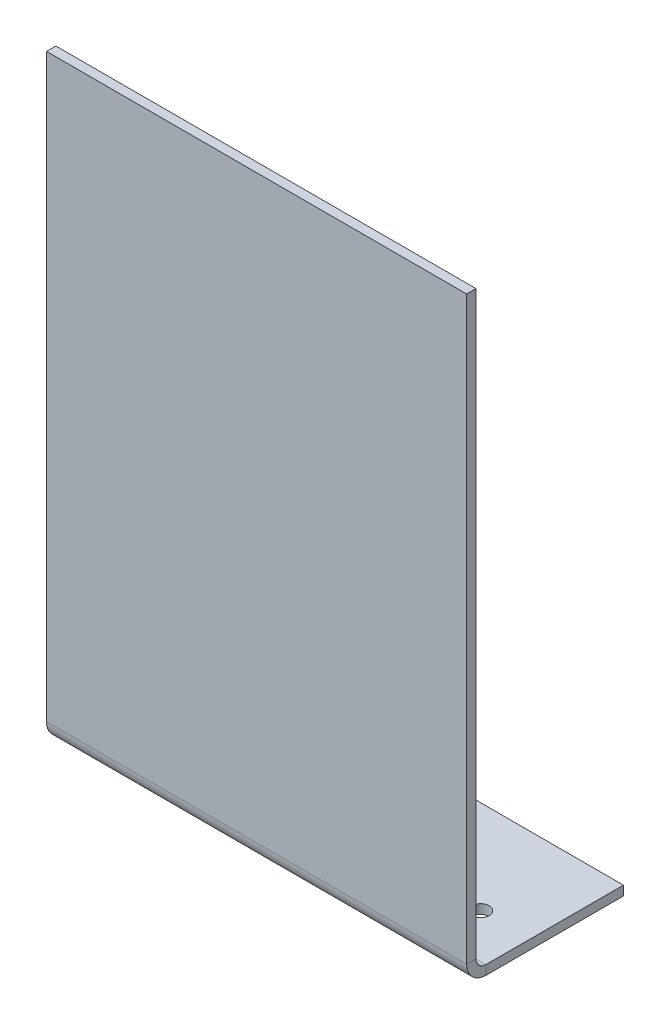
ISO-10303-21;
HEADER;
FILE_DESCRIPTION(('STEP AP214'),'2;1');
FILE_NAME('part.step','',(''),(''),'','','');
FILE_SCHEMA(('AUTOMOTIVE_DESIGN { 1 0 10303 214 1 1 1 1 }'));
ENDSEC;
DATA;
#1=APPLICATION_CONTEXT('core data for automotive mechanical design processes');
#2=APPLICATION_PROTOCOL_DEFINITION('international standard','automotive_design',2000,#1);
#3=PRODUCT_CONTEXT('',#1,'mechanical');
#4=PRODUCT('Part','Part','',(#3));
#5=PRODUCT_RELATED_PRODUCT_CATEGORY('part','',(#4));
#6=PRODUCT_DEFINITION_FORMATION('','',#4);
#7=PRODUCT_DEFINITION_CONTEXT('part definition',#1,'design');
#8=PRODUCT_DEFINITION('design','',#6,#7);
#9=PRODUCT_DEFINITION_SHAPE('','',#8);
#10=(LENGTH_UNIT() NAMED_UNIT(*) SI_UNIT(.MILLI.,.METRE.));
#11=(NAMED_UNIT(*) PLANE_ANGLE_UNIT() SI_UNIT($,.RADIAN.));
#12=(NAMED_UNIT(*) SI_UNIT($,.STERADIAN.) SOLID_ANGLE_UNIT());
#13=UNCERTAINTY_MEASURE_WITH_UNIT(LENGTH_MEASURE(1.E-05),#10,'distance_accuracy_value','');
#14=(GEOMETRIC_REPRESENTATION_CONTEXT(3) GLOBAL_UNCERTAINTY_ASSIGNED_CONTEXT((#13)) GLOBAL_UNIT_ASSIGNED_CONTEXT((#10,
#11,#12)) REPRESENTATION_CONTEXT('',''));
#15=CARTESIAN_POINT('',(0.,0.,0.));
#16=DIRECTION('',(0.,0.,1.));
#17=DIRECTION('',(1.,0.,0.));
#18=AXIS2_PLACEMENT_3D('',#15,#16,#17);
#19=CARTESIAN_POINT('',(0.,-25.5630304170245,26.8371695829756));
#20=DIRECTION('',(-1.,0.,0.));
#21=DIRECTION('',(0.,1.,0.));
#22=AXIS2_PLACEMENT_3D('',#19,#20,#21);
#23=PLANE('',#22);
#24=DIRECTION('',(0.,1.,0.));
#25=VECTOR('',#24,1.);
#26=CARTESIAN_POINT('',(0.,-25.5630304170245,25.2369695829756));
#27=LINE('',#26,#25);
#28=CARTESIAN_POINT('',(0.,1.70000000000001,25.2369695829755));
#29=VERTEX_POINT('',#28);
#30=CARTESIAN_POINT('',(0.,101.036969582976,25.2369695829752));
#31=VERTEX_POINT('',#30);
#32=EDGE_CURVE('E73',#29,#31,#27,.T.);
#33=ORIENTED_EDGE('',*,*,#32,.F.);
#34=DIRECTION('',(0.,0.,1.));
#35=VECTOR('',#34,1.);
#36=CARTESIAN_POINT('',(0.,1.70000000000001,26.8371695829755));
#37=LINE('',#36,#35);
#38=CARTESIAN_POINT('',(0.,1.70000000000001,26.8371695829755));
#39=VERTEX_POINT('',#38);
#40=EDGE_CURVE('E114',#29,#39,#37,.T.);
#41=ORIENTED_EDGE('',*,*,#40,.T.);
#42=DIRECTION('',(0.,1.,0.));
#43=VECTOR('',#42,1.);
#44=CARTESIAN_POINT('',(0.,-25.5630304170245,26.8371695829756));
#45=LINE('',#44,#43);
#46=CARTESIAN_POINT('',(0.,101.036969582976,26.8371695829752));
#47=VERTEX_POINT('',#46);
#48=EDGE_CURVE('E52',#39,#47,#45,.T.);
#49=ORIENTED_EDGE('',*,*,#48,.T.);
#50=DIRECTION('',(0.,0.,-1.));
#51=VECTOR('',#50,1.);
#52=CARTESIAN_POINT('',(0.,101.036969582976,26.8371695829752));
#53=LINE('',#52,#51);
#54=EDGE_CURVE('E225',#47,#31,#53,.T.);
#55=ORIENTED_EDGE('',*,*,#54,.T.);
#56=EDGE_LOOP('',(#33,#41,#49,#55));
#57=FACE_BOUND('',#56,.T.);
#58=ADVANCED_FACE('F48',(#57),#23,.T.);
#59=CARTESIAN_POINT('',(71.89414,-25.5630304170245,26.8371695829756));
#60=DIRECTION('',(1.,0.,0.));
#61=DIRECTION('',(0.,-1.,0.));
#62=AXIS2_PLACEMENT_3D('',#59,#60,#61);
#63=PLANE('',#62);
#64=DIRECTION('',(0.,-1.,0.));
#65=VECTOR('',#64,1.);
#66=CARTESIAN_POINT('',(71.89414,-25.5630304170245,26.8371695829756));
#67=LINE('',#66,#65);
#68=CARTESIAN_POINT('',(71.89414,101.036969582976,26.8371695829752));
#69=VERTEX_POINT('',#68);
#70=CARTESIAN_POINT('',(71.89414,1.70000000000002,26.8371695829755));
#71=VERTEX_POINT('',#70);
#72=EDGE_CURVE('E219',#69,#71,#67,.T.);
#73=ORIENTED_EDGE('',*,*,#72,.T.);
#74=DIRECTION('',(0.,0.,-1.));
#75=VECTOR('',#74,1.);
#76=CARTESIAN_POINT('',(71.89414,1.70000000000001,26.8371695829755));
#77=LINE('',#76,#75);
#78=CARTESIAN_POINT('',(71.89414,1.70000000000001,25.2369695829755));
#79=VERTEX_POINT('',#78);
#80=EDGE_CURVE('E12',#71,#79,#77,.T.);
#81=ORIENTED_EDGE('',*,*,#80,.T.);
#82=DIRECTION('',(0.,-1.,0.));
#83=VECTOR('',#82,1.);
#84=CARTESIAN_POINT('',(71.89414,-25.5630304170245,25.2369695829756));
#85=LINE('',#84,#83);
#86=CARTESIAN_POINT('',(71.89414,101.036969582976,25.2369695829752));
#87=VERTEX_POINT('',#86);
#88=EDGE_CURVE('E66',#87,#79,#85,.T.);
#89=ORIENTED_EDGE('',*,*,#88,.F.);
#90=DIRECTION('',(0.,0.,-1.));
#91=VECTOR('',#90,1.);
#92=CARTESIAN_POINT('',(71.89414,101.036969582976,26.8371695829752));
#93=LINE('',#92,#91);
#94=EDGE_CURVE('E142',#69,#87,#93,.T.);
#95=ORIENTED_EDGE('',*,*,#94,.F.);
#96=EDGE_LOOP('',(#73,#81,#89,#95));
#97=FACE_BOUND('',#96,.T.);
#98=ADVANCED_FACE('F50',(#97),#63,.T.);
#99=CARTESIAN_POINT('',(0.,-25.5630304170245,25.2369695829756));
#100=DIRECTION('',(0.,0.,-1.));
#101=DIRECTION('',(0.,1.,0.));
#102=AXIS2_PLACEMENT_3D('',#99,#100,#101);
#103=PLANE('',#102);
#104=ORIENTED_EDGE('',*,*,#88,.T.);
#105=DIRECTION('',(-1.,0.,0.));
#106=VECTOR('',#105,1.);
#107=CARTESIAN_POINT('',(0.,1.70000000000001,25.2369695829755));
#108=LINE('',#107,#106);
#109=EDGE_CURVE('E58',#79,#29,#108,.T.);
#110=ORIENTED_EDGE('',*,*,#109,.T.);
#111=ORIENTED_EDGE('',*,*,#32,.T.);
#112=DIRECTION('',(1.,0.,0.));
#113=VECTOR('',#112,1.);
#114=CARTESIAN_POINT('',(0.,101.036969582976,25.2369695829752));
#115=LINE('',#114,#113);
#116=EDGE_CURVE('E220',#31,#87,#115,.T.);
#117=ORIENTED_EDGE('',*,*,#116,.T.);
#118=EDGE_LOOP('',(#104,#110,#111,#117));
#119=FACE_BOUND('',#118,.T.);
#120=ADVANCED_FACE('F234',(#119),#103,.T.);
#121=CARTESIAN_POINT('',(0.,101.036969582976,26.8371695829752));
#122=DIRECTION('',(0.,1.,0.));
#123=DIRECTION('',(1.,0.,0.));
#124=AXIS2_PLACEMENT_3D('',#121,#122,#123);
#125=PLANE('',#124);
#126=ORIENTED_EDGE('',*,*,#116,.F.);
#127=ORIENTED_EDGE('',*,*,#54,.F.);
#128=DIRECTION('',(1.,0.,0.));
#129=VECTOR('',#128,1.);
#130=CARTESIAN_POINT('',(0.,101.036969582976,26.8371695829752));
#131=LINE('',#130,#129);
#132=EDGE_CURVE('E131',#47,#69,#131,.T.);
#133=ORIENTED_EDGE('',*,*,#132,.T.);
#134=ORIENTED_EDGE('',*,*,#94,.T.);
#135=EDGE_LOOP('',(#126,#127,#133,#134));
#136=FACE_BOUND('',#135,.T.);
#137=ADVANCED_FACE('F238',(#136),#125,.T.);
#138=CARTESIAN_POINT('',(0.,-25.5630304170245,26.8371695829756));
#139=DIRECTION('',(0.,0.,-1.));
#140=DIRECTION('',(0.,1.,0.));
#141=AXIS2_PLACEMENT_3D('',#138,#139,#140);
#142=PLANE('',#141);
#143=DIRECTION('',(-1.,0.,0.));
#144=VECTOR('',#143,1.);
#145=CARTESIAN_POINT('',(0.,1.70000000000001,26.8371695829755));
#146=LINE('',#145,#144);
#147=EDGE_CURVE('E122',#71,#39,#146,.T.);
#148=ORIENTED_EDGE('',*,*,#147,.F.);
#149=ORIENTED_EDGE('',*,*,#72,.F.);
#150=ORIENTED_EDGE('',*,*,#132,.F.);
#151=ORIENTED_EDGE('',*,*,#48,.F.);
#152=EDGE_LOOP('',(#148,#149,#150,#151));
#153=FACE_BOUND('',#152,.T.);
#154=ADVANCED_FACE('F127',(#153),#142,.F.);
#155=CARTESIAN_POINT('',(0.,-1.6002,0.));
#156=DIRECTION('',(0.,0.,-1.));
#157=DIRECTION('',(-1.,0.,0.));
#158=AXIS2_PLACEMENT_3D('',#155,#156,#157);
#159=PLANE('',#158);
#160=DIRECTION('',(-1.,0.,0.));
#161=VECTOR('',#160,1.);
#162=CARTESIAN_POINT('',(0.,0.,0.));
#163=LINE('',#162,#161);
#164=CARTESIAN_POINT('',(71.89414,0.,0.));
#165=VERTEX_POINT('',#164);
#166=CARTESIAN_POINT('',(0.,0.,0.));
#167=VERTEX_POINT('',#166);
#168=EDGE_CURVE('E175',#165,#167,#163,.T.);
#169=ORIENTED_EDGE('',*,*,#168,.F.);
#170=DIRECTION('',(0.,1.,0.));
#171=VECTOR('',#170,1.);
#172=CARTESIAN_POINT('',(71.89414,-1.6002,0.));
#173=LINE('',#172,#171);
#174=CARTESIAN_POINT('',(71.89414,-1.6002,0.));
#175=VERTEX_POINT('',#174);
#176=EDGE_CURVE('E165',#175,#165,#173,.T.);
#177=ORIENTED_EDGE('',*,*,#176,.F.);
#178=DIRECTION('',(-1.,0.,0.));
#179=VECTOR('',#178,1.);
#180=CARTESIAN_POINT('',(0.,-1.6002,0.));
#181=LINE('',#180,#179);
#182=CARTESIAN_POINT('',(0.,-1.6002,0.));
#183=VERTEX_POINT('',#182);
#184=EDGE_CURVE('E208',#175,#183,#181,.T.);
#185=ORIENTED_EDGE('',*,*,#184,.T.);
#186=DIRECTION('',(0.,1.,0.));
#187=VECTOR('',#186,1.);
#188=CARTESIAN_POINT('',(0.,-1.6002,0.));
#189=LINE('',#188,#187);
#190=EDGE_CURVE('E205',#183,#167,#189,.T.);
#191=ORIENTED_EDGE('',*,*,#190,.T.);
#192=EDGE_LOOP('',(#169,#177,#185,#191));
#193=FACE_BOUND('',#192,.T.);
#194=ADVANCED_FACE('F263',(#193),#159,.T.);
#195=CARTESIAN_POINT('',(8.44707,-1.6002,16.01));
#196=DIRECTION('',(0.,1.,0.));
#197=DIRECTION('',(0.,0.,1.));
#198=AXIS2_PLACEMENT_3D('',#195,#196,#197);
#199=CYLINDRICAL_SURFACE('',#198,1.4732);
#200=CARTESIAN_POINT('',(8.44707,-1.6002,16.01));
#201=DIRECTION('',(0.,1.,0.));
#202=DIRECTION('',(0.,0.,1.));
#203=AXIS2_PLACEMENT_3D('',#200,#201,#202);
#204=CIRCLE('',#203,1.4732);
#205=CARTESIAN_POINT('',(8.44707,-1.6002,17.4832));
#206=VERTEX_POINT('',#205);
#207=EDGE_CURVE('E189',#206,#206,#204,.T.);
#208=ORIENTED_EDGE('',*,*,#207,.F.);
#209=EDGE_LOOP('',(#208));
#210=FACE_BOUND('',#209,.T.);
#211=CARTESIAN_POINT('',(8.44707,0.,16.01));
#212=DIRECTION('',(0.,1.,0.));
#213=DIRECTION('',(0.,0.,1.));
#214=AXIS2_PLACEMENT_3D('',#211,#212,#213);
#215=CIRCLE('',#214,1.4732);
#216=CARTESIAN_POINT('',(8.44707,0.,17.4832));
#217=VERTEX_POINT('',#216);
#218=EDGE_CURVE('E201',#217,#217,#215,.T.);
#219=ORIENTED_EDGE('',*,*,#218,.T.);
#220=EDGE_LOOP('',(#219));
#221=FACE_BOUND('',#220,.T.);
#222=ADVANCED_FACE('F265',(#210,#221),#199,.F.);
#223=CARTESIAN_POINT('',(63.44707,-1.6002,16.01));
#224=DIRECTION('',(0.,1.,0.));
#225=DIRECTION('',(0.,0.,1.));
#226=AXIS2_PLACEMENT_3D('',#223,#224,#225);
#227=CYLINDRICAL_SURFACE('',#226,1.47320000000001);
#228=CARTESIAN_POINT('',(63.44707,-1.6002,16.01));
#229=DIRECTION('',(0.,1.,0.));
#230=DIRECTION('',(0.,0.,1.));
#231=AXIS2_PLACEMENT_3D('',#228,#229,#230);
#232=CIRCLE('',#231,1.47320000000001);
#233=CARTESIAN_POINT('',(63.44707,-1.6002,17.4832));
#234=VERTEX_POINT('',#233);
#235=EDGE_CURVE('E193',#234,#234,#232,.T.);
#236=ORIENTED_EDGE('',*,*,#235,.F.);
#237=EDGE_LOOP('',(#236));
#238=FACE_BOUND('',#237,.T.);
#239=CARTESIAN_POINT('',(63.44707,0.,16.01));
#240=DIRECTION('',(0.,1.,0.));
#241=DIRECTION('',(0.,0.,1.));
#242=AXIS2_PLACEMENT_3D('',#239,#240,#241);
#243=CIRCLE('',#242,1.47320000000001);
#244=CARTESIAN_POINT('',(63.44707,0.,17.4832));
#245=VERTEX_POINT('',#244);
#246=EDGE_CURVE('E197',#245,#245,#243,.T.);
#247=ORIENTED_EDGE('',*,*,#246,.T.);
#248=EDGE_LOOP('',(#247));
#249=FACE_BOUND('',#248,.T.);
#250=ADVANCED_FACE('F271',(#238,#249),#227,.F.);
#251=CARTESIAN_POINT('',(0.,-1.6002,0.));
#252=DIRECTION('',(0.,1.,0.));
#253=DIRECTION('',(0.,0.,1.));
#254=AXIS2_PLACEMENT_3D('',#251,#252,#253);
#255=PLANE('',#254);
#256=ORIENTED_EDGE('',*,*,#235,.T.);
#257=EDGE_LOOP('',(#256));
#258=FACE_BOUND('',#257,.T.);
#259=ORIENTED_EDGE('',*,*,#207,.T.);
#260=EDGE_LOOP('',(#259));
#261=FACE_BOUND('',#260,.T.);
#262=DIRECTION('',(0.,0.,-1.));
#263=VECTOR('',#262,1.);
#264=CARTESIAN_POINT('',(71.89414,-1.6002,0.));
#265=LINE('',#264,#263);
#266=CARTESIAN_POINT('',(71.89414,-1.6002,23.5369695829755));
#267=VERTEX_POINT('',#266);
#268=EDGE_CURVE('E169',#267,#175,#265,.T.);
#269=ORIENTED_EDGE('',*,*,#268,.F.);
#270=DIRECTION('',(-1.,0.,0.));
#271=VECTOR('',#270,1.);
#272=CARTESIAN_POINT('',(0.,-1.6002,23.5369695829755));
#273=LINE('',#272,#271);
#274=CARTESIAN_POINT('',(0.,-1.6002,23.5369695829755));
#275=VERTEX_POINT('',#274);
#276=EDGE_CURVE('E185',#267,#275,#273,.T.);
#277=ORIENTED_EDGE('',*,*,#276,.T.);
#278=DIRECTION('',(0.,0.,1.));
#279=VECTOR('',#278,1.);
#280=CARTESIAN_POINT('',(0.,-1.6002,0.));
#281=LINE('',#280,#279);
#282=EDGE_CURVE('E182',#183,#275,#281,.T.);
#283=ORIENTED_EDGE('',*,*,#282,.F.);
#284=ORIENTED_EDGE('',*,*,#184,.F.);
#285=EDGE_LOOP('',(#269,#277,#283,#284));
#286=FACE_BOUND('',#285,.T.);
#287=ADVANCED_FACE('F261',(#258,#261,#286),#255,.F.);
#288=CARTESIAN_POINT('',(0.,-1.6002,0.));
#289=DIRECTION('',(-1.,0.,0.));
#290=DIRECTION('',(0.,0.,1.));
#291=AXIS2_PLACEMENT_3D('',#288,#289,#290);
#292=PLANE('',#291);
#293=DIRECTION('',(0.,-1.,0.));
#294=VECTOR('',#293,1.);
#295=CARTESIAN_POINT('',(0.,-1.6002,23.5369695829755));
#296=LINE('',#295,#294);
#297=CARTESIAN_POINT('',(0.,0.,23.5369695829755));
#298=VERTEX_POINT('',#297);
#299=EDGE_CURVE('E147',#298,#275,#296,.T.);
#300=ORIENTED_EDGE('',*,*,#299,.F.);
#301=DIRECTION('',(0.,0.,1.));
#302=VECTOR('',#301,1.);
#303=CARTESIAN_POINT('',(0.,0.,0.));
#304=LINE('',#303,#302);
#305=EDGE_CURVE('E172',#167,#298,#304,.T.);
#306=ORIENTED_EDGE('',*,*,#305,.F.);
#307=ORIENTED_EDGE('',*,*,#190,.F.);
#308=ORIENTED_EDGE('',*,*,#282,.T.);
#309=EDGE_LOOP('',(#300,#306,#307,#308));
#310=FACE_BOUND('',#309,.T.);
#311=ADVANCED_FACE('F257',(#310),#292,.T.);
#312=CARTESIAN_POINT('',(0.,0.,0.));
#313=DIRECTION('',(0.,1.,0.));
#314=DIRECTION('',(0.,0.,1.));
#315=AXIS2_PLACEMENT_3D('',#312,#313,#314);
#316=PLANE('',#315);
#317=DIRECTION('',(-1.,0.,0.));
#318=VECTOR('',#317,1.);
#319=CARTESIAN_POINT('',(0.,0.,23.5369695829755));
#320=LINE('',#319,#318);
#321=CARTESIAN_POINT('',(71.89414,0.,23.5369695829755));
#322=VERTEX_POINT('',#321);
#323=EDGE_CURVE('E154',#322,#298,#320,.T.);
#324=ORIENTED_EDGE('',*,*,#323,.F.);
#325=DIRECTION('',(0.,0.,-1.));
#326=VECTOR('',#325,1.);
#327=CARTESIAN_POINT('',(71.89414,0.,0.));
#328=LINE('',#327,#326);
#329=EDGE_CURVE('E179',#322,#165,#328,.T.);
#330=ORIENTED_EDGE('',*,*,#329,.T.);
#331=ORIENTED_EDGE('',*,*,#168,.T.);
#332=ORIENTED_EDGE('',*,*,#305,.T.);
#333=EDGE_LOOP('',(#324,#330,#331,#332));
#334=FACE_BOUND('',#333,.T.);
#335=ORIENTED_EDGE('',*,*,#246,.F.);
#336=EDGE_LOOP('',(#335));
#337=FACE_BOUND('',#336,.T.);
#338=ORIENTED_EDGE('',*,*,#218,.F.);
#339=EDGE_LOOP('',(#338));
#340=FACE_BOUND('',#339,.T.);
#341=ADVANCED_FACE('F253',(#334,#337,#340),#316,.T.);
#342=CARTESIAN_POINT('',(71.89414,-1.6002,0.));
#343=DIRECTION('',(1.,0.,0.));
#344=DIRECTION('',(0.,0.,-1.));
#345=AXIS2_PLACEMENT_3D('',#342,#343,#344);
#346=PLANE('',#345);
#347=DIRECTION('',(0.,1.,0.));
#348=VECTOR('',#347,1.);
#349=CARTESIAN_POINT('',(71.89414,-1.6002,23.5369695829755));
#350=LINE('',#349,#348);
#351=EDGE_CURVE('E149',#267,#322,#350,.T.);
#352=ORIENTED_EDGE('',*,*,#351,.F.);
#353=ORIENTED_EDGE('',*,*,#268,.T.);
#354=ORIENTED_EDGE('',*,*,#176,.T.);
#355=ORIENTED_EDGE('',*,*,#329,.F.);
#356=EDGE_LOOP('',(#352,#353,#354,#355));
#357=FACE_BOUND('',#356,.T.);
#358=ADVANCED_FACE('F248',(#357),#346,.T.);
#359=CARTESIAN_POINT('',(71.89414,1.7,23.5369695829755));
#360=DIRECTION('',(1.,0.,0.));
#361=DIRECTION('',(0.,0.,-1.));
#362=AXIS2_PLACEMENT_3D('',#359,#360,#361);
#363=PLANE('',#362);
#364=ORIENTED_EDGE('',*,*,#351,.T.);
#365=CARTESIAN_POINT('',(71.89414,1.7,23.5369695829755));
#366=DIRECTION('',(-1.,0.,0.));
#367=DIRECTION('',(0.,0.,1.));
#368=AXIS2_PLACEMENT_3D('',#365,#366,#367);
#369=CIRCLE('',#368,1.7);
#370=EDGE_CURVE('E161',#322,#79,#369,.T.);
#371=ORIENTED_EDGE('',*,*,#370,.T.);
#372=ORIENTED_EDGE('',*,*,#80,.F.);
#373=CARTESIAN_POINT('',(71.89414,1.7,23.5369695829755));
#374=DIRECTION('',(-1.,0.,0.));
#375=DIRECTION('',(0.,0.,-1.));
#376=AXIS2_PLACEMENT_3D('',#373,#374,#375);
#377=CIRCLE('',#376,3.3002);
#378=EDGE_CURVE('E140',#267,#71,#377,.T.);
#379=ORIENTED_EDGE('',*,*,#378,.F.);
#380=EDGE_LOOP('',(#364,#371,#372,#379));
#381=FACE_BOUND('',#380,.T.);
#382=ADVANCED_FACE('F245',(#381),#363,.T.);
#383=CARTESIAN_POINT('',(0.,1.7,23.5369695829755));
#384=DIRECTION('',(-1.,0.,0.));
#385=DIRECTION('',(0.,0.,1.));
#386=AXIS2_PLACEMENT_3D('',#383,#384,#385);
#387=PLANE('',#386);
#388=ORIENTED_EDGE('',*,*,#40,.F.);
#389=CARTESIAN_POINT('',(0.,1.7,23.5369695829755));
#390=DIRECTION('',(-1.,0.,0.));
#391=DIRECTION('',(0.,0.,1.));
#392=AXIS2_PLACEMENT_3D('',#389,#390,#391);
#393=CIRCLE('',#392,1.7);
#394=EDGE_CURVE('E156',#29,#298,#393,.F.);
#395=ORIENTED_EDGE('',*,*,#394,.T.);
#396=ORIENTED_EDGE('',*,*,#299,.T.);
#397=CARTESIAN_POINT('',(0.,1.7,23.5369695829755));
#398=DIRECTION('',(1.,0.,0.));
#399=DIRECTION('',(0.,0.,1.));
#400=AXIS2_PLACEMENT_3D('',#397,#398,#399);
#401=CIRCLE('',#400,3.3002);
#402=EDGE_CURVE('E138',#39,#275,#401,.T.);
#403=ORIENTED_EDGE('',*,*,#402,.F.);
#404=EDGE_LOOP('',(#388,#395,#396,#403));
#405=FACE_BOUND('',#404,.T.);
#406=ADVANCED_FACE('F145',(#405),#387,.T.);
#407=CARTESIAN_POINT('',(107.955482950978,1.7,23.5369695829755));
#408=DIRECTION('',(-1.,0.,0.));
#409=DIRECTION('',(0.,0.,1.));
#410=AXIS2_PLACEMENT_3D('',#407,#408,#409);
#411=CYLINDRICAL_SURFACE('',#410,3.3002);
#412=ORIENTED_EDGE('',*,*,#402,.T.);
#413=ORIENTED_EDGE('',*,*,#276,.F.);
#414=ORIENTED_EDGE('',*,*,#378,.T.);
#415=ORIENTED_EDGE('',*,*,#147,.T.);
#416=EDGE_LOOP('',(#412,#413,#414,#415));
#417=FACE_BOUND('',#416,.T.);
#418=ADVANCED_FACE('F136',(#417),#411,.T.);
#419=CARTESIAN_POINT('',(107.955482950978,1.7,23.5369695829755));
#420=DIRECTION('',(-1.,0.,0.));
#421=DIRECTION('',(0.,0.,1.));
#422=AXIS2_PLACEMENT_3D('',#419,#420,#421);
#423=CYLINDRICAL_SURFACE('',#422,1.7);
#424=ORIENTED_EDGE('',*,*,#394,.F.);
#425=ORIENTED_EDGE('',*,*,#109,.F.);
#426=ORIENTED_EDGE('',*,*,#370,.F.);
#427=ORIENTED_EDGE('',*,*,#323,.T.);
#428=EDGE_LOOP('',(#424,#425,#426,#427));
#429=FACE_BOUND('',#428,.T.);
#430=ADVANCED_FACE('F244',(#429),#423,.F.);
#431=CLOSED_SHELL('',(#58,#98,#120,#137,#154,#194,#222,#250,#287,#311,#341,#358,#382,#406,#418,#430));
#432=MANIFOLD_SOLID_BREP('B2',#431);
#433=ADVANCED_BREP_SHAPE_REPRESENTATION('',(#18,#432),#14);
#434=SHAPE_DEFINITION_REPRESENTATION(#9,#433);
ENDSEC;
END-ISO-10303-21;
